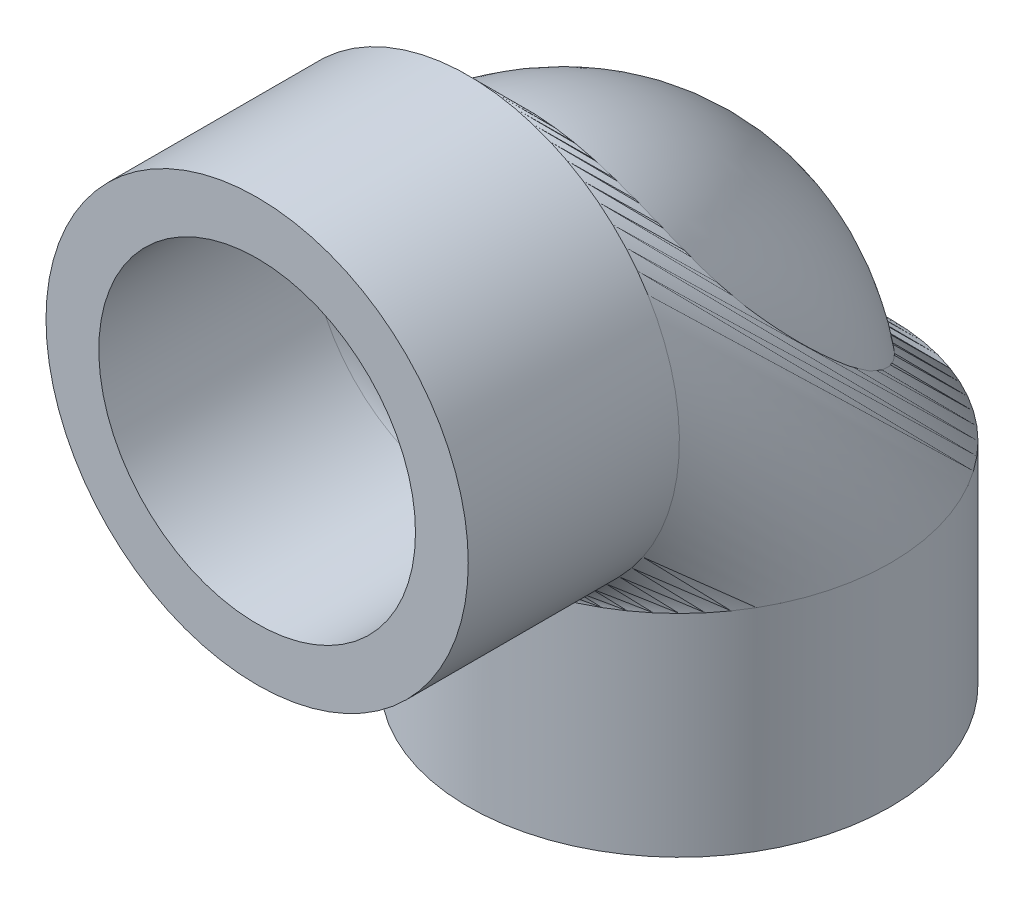
ISO-10303-21;
HEADER;
FILE_DESCRIPTION(('STEP AP214'),'2;1');
FILE_NAME('part.step','',(''),(''),'','','');
FILE_SCHEMA(('AUTOMOTIVE_DESIGN { 1 0 10303 214 1 1 1 1 }'));
ENDSEC;
DATA;
#1=APPLICATION_CONTEXT('core data for automotive mechanical design processes');
#2=APPLICATION_PROTOCOL_DEFINITION('international standard','automotive_design',2000,#1);
#3=PRODUCT_CONTEXT('',#1,'mechanical');
#4=PRODUCT('Part','Part','',(#3));
#5=PRODUCT_RELATED_PRODUCT_CATEGORY('part','',(#4));
#6=PRODUCT_DEFINITION_FORMATION('','',#4);
#7=PRODUCT_DEFINITION_CONTEXT('part definition',#1,'design');
#8=PRODUCT_DEFINITION('design','',#6,#7);
#9=PRODUCT_DEFINITION_SHAPE('','',#8);
#10=(LENGTH_UNIT() NAMED_UNIT(*) SI_UNIT(.MILLI.,.METRE.));
#11=(NAMED_UNIT(*) PLANE_ANGLE_UNIT() SI_UNIT($,.RADIAN.));
#12=(NAMED_UNIT(*) SI_UNIT($,.STERADIAN.) SOLID_ANGLE_UNIT());
#13=UNCERTAINTY_MEASURE_WITH_UNIT(LENGTH_MEASURE(1.E-05),#10,'distance_accuracy_value','');
#14=(GEOMETRIC_REPRESENTATION_CONTEXT(3) GLOBAL_UNCERTAINTY_ASSIGNED_CONTEXT((#13)) GLOBAL_UNIT_ASSIGNED_CONTEXT((#10,
#11,#12)) REPRESENTATION_CONTEXT('',''));
#15=CARTESIAN_POINT('',(0.,0.,0.));
#16=DIRECTION('',(0.,0.,1.));
#17=DIRECTION('',(1.,0.,0.));
#18=AXIS2_PLACEMENT_3D('',#15,#16,#17);
#19=CARTESIAN_POINT('',(0.,0.,0.));
#20=DIRECTION('',(0.,0.,1.));
#21=DIRECTION('',(1.,0.,0.));
#22=AXIS2_PLACEMENT_3D('',#19,#20,#21);
#23=PLANE('',#22);
#24=CARTESIAN_POINT('',(0.,0.,0.));
#25=DIRECTION('',(0.,0.,1.));
#26=DIRECTION('',(1.,0.,0.));
#27=AXIS2_PLACEMENT_3D('',#24,#25,#26);
#28=CIRCLE('',#27,7.5);
#29=CARTESIAN_POINT('',(7.5,0.,0.));
#30=VERTEX_POINT('',#29);
#31=EDGE_CURVE('E67',#30,#30,#28,.T.);
#32=ORIENTED_EDGE('',*,*,#31,.F.);
#33=EDGE_LOOP('',(#32));
#34=FACE_BOUND('',#33,.T.);
#35=CARTESIAN_POINT('',(0.,0.,0.));
#36=DIRECTION('',(0.,0.,1.));
#37=DIRECTION('',(1.,0.,0.));
#38=AXIS2_PLACEMENT_3D('',#35,#36,#37);
#39=CIRCLE('',#38,10.);
#40=CARTESIAN_POINT('',(10.,0.,0.));
#41=VERTEX_POINT('',#40);
#42=EDGE_CURVE('E56',#41,#41,#39,.T.);
#43=ORIENTED_EDGE('',*,*,#42,.T.);
#44=EDGE_LOOP('',(#43));
#45=FACE_BOUND('',#44,.T.);
#46=ADVANCED_FACE('F39',(#34,#45),#23,.T.);
#47=CARTESIAN_POINT('',(0.,-20.,-20.));
#48=DIRECTION('',(0.,1.,0.));
#49=DIRECTION('',(1.,0.,0.));
#50=AXIS2_PLACEMENT_3D('',#47,#48,#49);
#51=PLANE('',#50);
#52=CARTESIAN_POINT('',(0.,-20.,-20.));
#53=DIRECTION('',(0.,1.,0.));
#54=DIRECTION('',(0.,0.,1.));
#55=AXIS2_PLACEMENT_3D('',#52,#53,#54);
#56=CIRCLE('',#55,7.5);
#57=CARTESIAN_POINT('',(0.,-20.,-12.5));
#58=VERTEX_POINT('',#57);
#59=EDGE_CURVE('E61',#58,#58,#56,.T.);
#60=ORIENTED_EDGE('',*,*,#59,.T.);
#61=EDGE_LOOP('',(#60));
#62=FACE_BOUND('',#61,.T.);
#63=CARTESIAN_POINT('',(0.,-20.,-20.));
#64=DIRECTION('',(0.,1.,0.));
#65=DIRECTION('',(1.,0.,0.));
#66=AXIS2_PLACEMENT_3D('',#63,#64,#65);
#67=CIRCLE('',#66,10.);
#68=CARTESIAN_POINT('',(10.,-20.,-20.));
#69=VERTEX_POINT('',#68);
#70=EDGE_CURVE('E11',#69,#69,#67,.T.);
#71=ORIENTED_EDGE('',*,*,#70,.F.);
#72=EDGE_LOOP('',(#71));
#73=FACE_BOUND('',#72,.T.);
#74=ADVANCED_FACE('F97',(#62,#73),#51,.F.);
#75=CARTESIAN_POINT('',(0.,0.,0.));
#76=DIRECTION('',(0.,0.,-1.));
#77=DIRECTION('',(-1.,0.,0.));
#78=AXIS2_PLACEMENT_3D('',#75,#76,#77);
#79=CYLINDRICAL_SURFACE('',#78,10.);
#80=CARTESIAN_POINT('',(0.,0.,-10.));
#81=DIRECTION('',(0.,0.,1.));
#82=DIRECTION('',(1.,0.,0.));
#83=AXIS2_PLACEMENT_3D('',#80,#81,#82);
#84=CIRCLE('',#83,10.);
#85=CARTESIAN_POINT('',(0.,-10.,-10.));
#86=VERTEX_POINT('',#85);
#87=EDGE_CURVE('E51',#86,#86,#84,.T.);
#88=ORIENTED_EDGE('',*,*,#87,.T.);
#89=EDGE_LOOP('',(#88));
#90=FACE_BOUND('',#89,.T.);
#91=ORIENTED_EDGE('',*,*,#42,.F.);
#92=EDGE_LOOP('',(#91));
#93=FACE_BOUND('',#92,.T.);
#94=ADVANCED_FACE('F100',(#90,#93),#79,.T.);
#95=CARTESIAN_POINT('',(0.,-10.,-10.));
#96=DIRECTION('',(-1.,0.,0.));
#97=DIRECTION('',(0.,0.,1.));
#98=AXIS2_PLACEMENT_3D('',#95,#96,#97);
#99=TOROIDAL_SURFACE('',#98,10.,10.);
#100=CARTESIAN_POINT('',(0.,-10.,-20.));
#101=DIRECTION('',(0.,1.,0.));
#102=DIRECTION('',(1.,0.,0.));
#103=AXIS2_PLACEMENT_3D('',#100,#101,#102);
#104=CIRCLE('',#103,10.);
#105=EDGE_CURVE('E46',#86,#86,#104,.T.);
#106=ORIENTED_EDGE('',*,*,#105,.T.);
#107=ORIENTED_EDGE('',*,*,#87,.F.);
#108=EDGE_LOOP('',(#106,#107));
#109=FACE_BOUND('',#108,.T.);
#110=ADVANCED_FACE('F52',(#109),#99,.T.);
#111=CARTESIAN_POINT('',(0.,-10.,-20.));
#112=DIRECTION('',(0.,-1.,0.));
#113=DIRECTION('',(0.,0.,-1.));
#114=AXIS2_PLACEMENT_3D('',#111,#112,#113);
#115=CYLINDRICAL_SURFACE('',#114,10.);
#116=ORIENTED_EDGE('',*,*,#70,.T.);
#117=EDGE_LOOP('',(#116));
#118=FACE_BOUND('',#117,.T.);
#119=ORIENTED_EDGE('',*,*,#105,.F.);
#120=EDGE_LOOP('',(#119));
#121=FACE_BOUND('',#120,.T.);
#122=ADVANCED_FACE('F91',(#118,#121),#115,.T.);
#123=CARTESIAN_POINT('',(0.,0.,5.));
#124=DIRECTION('',(0.,0.,-1.));
#125=DIRECTION('',(-1.,0.,0.));
#126=AXIS2_PLACEMENT_3D('',#123,#124,#125);
#127=CYLINDRICAL_SURFACE('',#126,7.5);
#128=CARTESIAN_POINT('',(0.,0.,-9.99999999999993));
#129=DIRECTION('',(0.,0.,1.));
#130=DIRECTION('',(1.,0.,0.));
#131=AXIS2_PLACEMENT_3D('',#128,#129,#130);
#132=CIRCLE('',#131,7.5);
#133=CARTESIAN_POINT('',(0.,7.5,-9.99999999999988));
#134=VERTEX_POINT('',#133);
#135=EDGE_CURVE('E72',#134,#134,#132,.T.);
#136=ORIENTED_EDGE('',*,*,#135,.F.);
#137=EDGE_LOOP('',(#136));
#138=FACE_BOUND('',#137,.T.);
#139=ORIENTED_EDGE('',*,*,#31,.T.);
#140=EDGE_LOOP('',(#139));
#141=FACE_BOUND('',#140,.T.);
#142=ADVANCED_FACE('F85',(#138,#141),#127,.F.);
#143=CARTESIAN_POINT('',(0.,-10.,-10.));
#144=DIRECTION('',(-1.,0.,0.));
#145=DIRECTION('',(0.,0.,1.));
#146=AXIS2_PLACEMENT_3D('',#143,#144,#145);
#147=TOROIDAL_SURFACE('',#146,10.,7.5);
#148=CARTESIAN_POINT('',(0.,-10.,-20.));
#149=DIRECTION('',(0.,1.,0.));
#150=DIRECTION('',(1.,0.,0.));
#151=AXIS2_PLACEMENT_3D('',#148,#149,#150);
#152=CIRCLE('',#151,7.5);
#153=CARTESIAN_POINT('',(0.,-10.,-27.5));
#154=VERTEX_POINT('',#153);
#155=EDGE_CURVE('E71',#154,#154,#152,.T.);
#156=CARTESIAN_POINT('',(0.,-10.,-10.));
#157=DIRECTION('',(-1.,0.,0.));
#158=DIRECTION('',(0.,0.,1.));
#159=AXIS2_PLACEMENT_3D('',#156,#157,#158);
#160=CIRCLE('',#159,17.5);
#161=EDGE_CURVE('',#134,#154,#160,.T.);
#162=ORIENTED_EDGE('',*,*,#135,.T.);
#163=ORIENTED_EDGE('',*,*,#155,.F.);
#164=ORIENTED_EDGE('',*,*,#161,.T.);
#165=ORIENTED_EDGE('',*,*,#161,.F.);
#166=EDGE_LOOP('',(#162,#164,#163,#165));
#167=FACE_BOUND('',#166,.T.);
#168=ADVANCED_FACE('F82',(#167),#147,.F.);
#169=CARTESIAN_POINT('',(0.,-10.,-20.));
#170=DIRECTION('',(0.,-1.,0.));
#171=DIRECTION('',(0.,0.,-1.));
#172=AXIS2_PLACEMENT_3D('',#169,#170,#171);
#173=CYLINDRICAL_SURFACE('',#172,7.5);
#174=ORIENTED_EDGE('',*,*,#59,.F.);
#175=EDGE_LOOP('',(#174));
#176=FACE_BOUND('',#175,.T.);
#177=ORIENTED_EDGE('',*,*,#155,.T.);
#178=EDGE_LOOP('',(#177));
#179=FACE_BOUND('',#178,.T.);
#180=ADVANCED_FACE('F80',(#176,#179),#173,.F.);
#181=CLOSED_SHELL('',(#46,#74,#94,#110,#122,#142,#168,#180));
#182=MANIFOLD_SOLID_BREP('B2',#181);
#183=ADVANCED_BREP_SHAPE_REPRESENTATION('',(#18,#182),#14);
#184=SHAPE_DEFINITION_REPRESENTATION(#9,#183);
ENDSEC;
END-ISO-10303-21;
